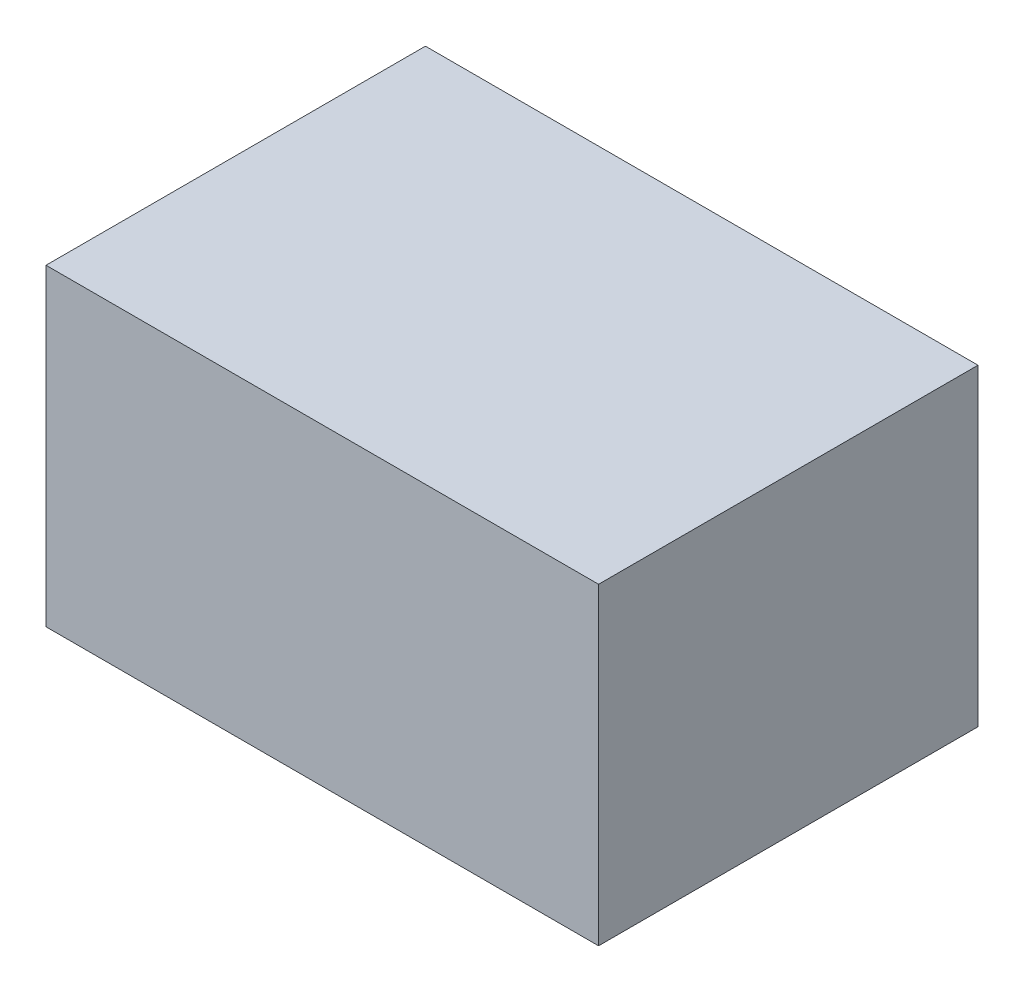
ISO-10303-21;
HEADER;
FILE_DESCRIPTION(('STEP AP214'),'2;1');
FILE_NAME('part.step','',(''),(''),'','','');
FILE_SCHEMA(('AUTOMOTIVE_DESIGN { 1 0 10303 214 1 1 1 1 }'));
ENDSEC;
DATA;
#1=APPLICATION_CONTEXT('core data for automotive mechanical design processes');
#2=APPLICATION_PROTOCOL_DEFINITION('international standard','automotive_design',2000,#1);
#3=PRODUCT_CONTEXT('',#1,'mechanical');
#4=PRODUCT('Part','Part','',(#3));
#5=PRODUCT_RELATED_PRODUCT_CATEGORY('part','',(#4));
#6=PRODUCT_DEFINITION_FORMATION('','',#4);
#7=PRODUCT_DEFINITION_CONTEXT('part definition',#1,'design');
#8=PRODUCT_DEFINITION('design','',#6,#7);
#9=PRODUCT_DEFINITION_SHAPE('','',#8);
#10=(LENGTH_UNIT() NAMED_UNIT(*) SI_UNIT(.MILLI.,.METRE.));
#11=(NAMED_UNIT(*) PLANE_ANGLE_UNIT() SI_UNIT($,.RADIAN.));
#12=(NAMED_UNIT(*) SI_UNIT($,.STERADIAN.) SOLID_ANGLE_UNIT());
#13=UNCERTAINTY_MEASURE_WITH_UNIT(LENGTH_MEASURE(1.E-05),#10,'distance_accuracy_value','');
#14=(GEOMETRIC_REPRESENTATION_CONTEXT(3) GLOBAL_UNCERTAINTY_ASSIGNED_CONTEXT((#13)) GLOBAL_UNIT_ASSIGNED_CONTEXT((#10,
#11,#12)) REPRESENTATION_CONTEXT('',''));
#15=CARTESIAN_POINT('',(0.,0.,0.));
#16=DIRECTION('',(0.,0.,1.));
#17=DIRECTION('',(1.,0.,0.));
#18=AXIS2_PLACEMENT_3D('',#15,#16,#17);
#19=CARTESIAN_POINT('',(15.,17.,10.3));
#20=DIRECTION('',(-1.,0.,0.));
#21=DIRECTION('',(0.,0.,1.));
#22=AXIS2_PLACEMENT_3D('',#19,#20,#21);
#23=PLANE('',#22);
#24=DIRECTION('',(0.,0.,-1.));
#25=VECTOR('',#24,1.);
#26=CARTESIAN_POINT('',(15.,0.,10.3));
#27=LINE('',#26,#25);
#28=CARTESIAN_POINT('',(15.,0.,10.3));
#29=VERTEX_POINT('',#28);
#30=CARTESIAN_POINT('',(15.,0.,-10.3));
#31=VERTEX_POINT('',#30);
#32=EDGE_CURVE('E98',#29,#31,#27,.T.);
#33=ORIENTED_EDGE('',*,*,#32,.T.);
#34=DIRECTION('',(0.,-1.,0.));
#35=VECTOR('',#34,1.);
#36=CARTESIAN_POINT('',(15.,17.,-10.3));
#37=LINE('',#36,#35);
#38=CARTESIAN_POINT('',(15.,17.,-10.3));
#39=VERTEX_POINT('',#38);
#40=EDGE_CURVE('E11',#39,#31,#37,.T.);
#41=ORIENTED_EDGE('',*,*,#40,.F.);
#42=DIRECTION('',(0.,0.,-1.));
#43=VECTOR('',#42,1.);
#44=CARTESIAN_POINT('',(15.,17.,10.3));
#45=LINE('',#44,#43);
#46=CARTESIAN_POINT('',(15.,17.,10.3));
#47=VERTEX_POINT('',#46);
#48=EDGE_CURVE('E86',#47,#39,#45,.T.);
#49=ORIENTED_EDGE('',*,*,#48,.F.);
#50=DIRECTION('',(0.,-1.,0.));
#51=VECTOR('',#50,1.);
#52=CARTESIAN_POINT('',(15.,17.,10.3));
#53=LINE('',#52,#51);
#54=EDGE_CURVE('E94',#47,#29,#53,.T.);
#55=ORIENTED_EDGE('',*,*,#54,.T.);
#56=EDGE_LOOP('',(#33,#41,#49,#55));
#57=FACE_BOUND('',#56,.T.);
#58=ADVANCED_FACE('F35',(#57),#23,.F.);
#59=CARTESIAN_POINT('',(-15.,17.,-10.3));
#60=DIRECTION('',(0.,0.,1.));
#61=DIRECTION('',(1.,0.,0.));
#62=AXIS2_PLACEMENT_3D('',#59,#60,#61);
#63=PLANE('',#62);
#64=DIRECTION('',(-1.,0.,0.));
#65=VECTOR('',#64,1.);
#66=CARTESIAN_POINT('',(-15.,0.,-10.3));
#67=LINE('',#66,#65);
#68=CARTESIAN_POINT('',(-15.,0.,-10.3));
#69=VERTEX_POINT('',#68);
#70=EDGE_CURVE('E90',#31,#69,#67,.T.);
#71=ORIENTED_EDGE('',*,*,#70,.T.);
#72=DIRECTION('',(0.,-1.,0.));
#73=VECTOR('',#72,1.);
#74=CARTESIAN_POINT('',(-15.,17.,-10.3));
#75=LINE('',#74,#73);
#76=CARTESIAN_POINT('',(-15.,17.,-10.3));
#77=VERTEX_POINT('',#76);
#78=EDGE_CURVE('E43',#77,#69,#75,.T.);
#79=ORIENTED_EDGE('',*,*,#78,.F.);
#80=DIRECTION('',(-1.,0.,0.));
#81=VECTOR('',#80,1.);
#82=CARTESIAN_POINT('',(-15.,17.,-10.3));
#83=LINE('',#82,#81);
#84=EDGE_CURVE('E81',#39,#77,#83,.T.);
#85=ORIENTED_EDGE('',*,*,#84,.F.);
#86=ORIENTED_EDGE('',*,*,#40,.T.);
#87=EDGE_LOOP('',(#71,#79,#85,#86));
#88=FACE_BOUND('',#87,.T.);
#89=ADVANCED_FACE('F89',(#88),#63,.F.);
#90=CARTESIAN_POINT('',(-15.,17.,10.3));
#91=DIRECTION('',(1.,0.,0.));
#92=DIRECTION('',(0.,0.,-1.));
#93=AXIS2_PLACEMENT_3D('',#90,#91,#92);
#94=PLANE('',#93);
#95=DIRECTION('',(0.,0.,1.));
#96=VECTOR('',#95,1.);
#97=CARTESIAN_POINT('',(-15.,0.,10.3));
#98=LINE('',#97,#96);
#99=CARTESIAN_POINT('',(-15.,0.,10.3));
#100=VERTEX_POINT('',#99);
#101=EDGE_CURVE('E68',#69,#100,#98,.T.);
#102=ORIENTED_EDGE('',*,*,#101,.T.);
#103=DIRECTION('',(0.,-1.,0.));
#104=VECTOR('',#103,1.);
#105=CARTESIAN_POINT('',(-15.,17.,10.3));
#106=LINE('',#105,#104);
#107=CARTESIAN_POINT('',(-15.,17.,10.3));
#108=VERTEX_POINT('',#107);
#109=EDGE_CURVE('E91',#108,#100,#106,.T.);
#110=ORIENTED_EDGE('',*,*,#109,.F.);
#111=DIRECTION('',(0.,0.,1.));
#112=VECTOR('',#111,1.);
#113=CARTESIAN_POINT('',(-15.,17.,10.3));
#114=LINE('',#113,#112);
#115=EDGE_CURVE('E84',#77,#108,#114,.T.);
#116=ORIENTED_EDGE('',*,*,#115,.F.);
#117=ORIENTED_EDGE('',*,*,#78,.T.);
#118=EDGE_LOOP('',(#102,#110,#116,#117));
#119=FACE_BOUND('',#118,.T.);
#120=ADVANCED_FACE('F92',(#119),#94,.F.);
#121=CARTESIAN_POINT('',(-15.,17.,10.3));
#122=DIRECTION('',(0.,0.,-1.));
#123=DIRECTION('',(-1.,0.,0.));
#124=AXIS2_PLACEMENT_3D('',#121,#122,#123);
#125=PLANE('',#124);
#126=DIRECTION('',(1.,0.,0.));
#127=VECTOR('',#126,1.);
#128=CARTESIAN_POINT('',(-15.,0.,10.3));
#129=LINE('',#128,#127);
#130=EDGE_CURVE('E74',#100,#29,#129,.T.);
#131=ORIENTED_EDGE('',*,*,#130,.T.);
#132=ORIENTED_EDGE('',*,*,#54,.F.);
#133=DIRECTION('',(1.,0.,0.));
#134=VECTOR('',#133,1.);
#135=CARTESIAN_POINT('',(-15.,17.,10.3));
#136=LINE('',#135,#134);
#137=EDGE_CURVE('E51',#108,#47,#136,.T.);
#138=ORIENTED_EDGE('',*,*,#137,.F.);
#139=ORIENTED_EDGE('',*,*,#109,.T.);
#140=EDGE_LOOP('',(#131,#132,#138,#139));
#141=FACE_BOUND('',#140,.T.);
#142=ADVANCED_FACE('F105',(#141),#125,.F.);
#143=CARTESIAN_POINT('',(0.,17.,0.));
#144=DIRECTION('',(0.,-1.,0.));
#145=DIRECTION('',(0.,0.,-1.));
#146=AXIS2_PLACEMENT_3D('',#143,#144,#145);
#147=PLANE('',#146);
#148=ORIENTED_EDGE('',*,*,#48,.T.);
#149=ORIENTED_EDGE('',*,*,#84,.T.);
#150=ORIENTED_EDGE('',*,*,#115,.T.);
#151=ORIENTED_EDGE('',*,*,#137,.T.);
#152=EDGE_LOOP('',(#148,#149,#150,#151));
#153=FACE_BOUND('',#152,.T.);
#154=ADVANCED_FACE('F82',(#153),#147,.F.);
#155=CARTESIAN_POINT('',(0.,0.,0.));
#156=DIRECTION('',(0.,-1.,0.));
#157=DIRECTION('',(0.,0.,-1.));
#158=AXIS2_PLACEMENT_3D('',#155,#156,#157);
#159=PLANE('',#158);
#160=ORIENTED_EDGE('',*,*,#32,.F.);
#161=ORIENTED_EDGE('',*,*,#130,.F.);
#162=ORIENTED_EDGE('',*,*,#101,.F.);
#163=ORIENTED_EDGE('',*,*,#70,.F.);
#164=EDGE_LOOP('',(#160,#161,#162,#163));
#165=FACE_BOUND('',#164,.T.);
#166=ADVANCED_FACE('F108',(#165),#159,.T.);
#167=CLOSED_SHELL('',(#58,#89,#120,#142,#154,#166));
#168=MANIFOLD_SOLID_BREP('B2',#167);
#169=ADVANCED_BREP_SHAPE_REPRESENTATION('',(#18,#168),#14);
#170=SHAPE_DEFINITION_REPRESENTATION(#9,#169);
ENDSEC;
END-ISO-10303-21;
